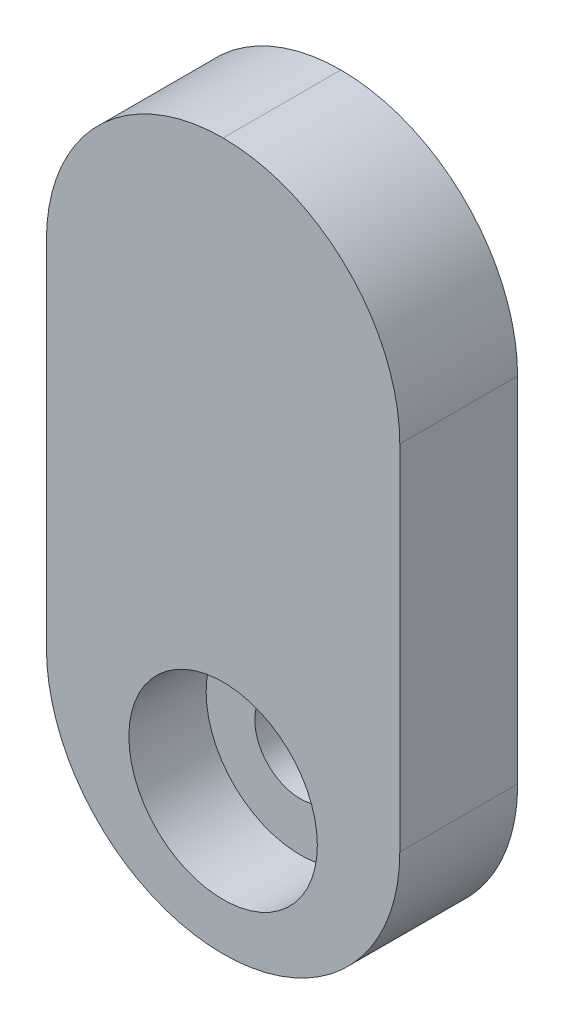
ISO-10303-21;
HEADER;
FILE_DESCRIPTION(('STEP AP214'),'2;1');
FILE_NAME('part.step','',(''),(''),'','','');
FILE_SCHEMA(('AUTOMOTIVE_DESIGN { 1 0 10303 214 1 1 1 1 }'));
ENDSEC;
DATA;
#1=APPLICATION_CONTEXT('core data for automotive mechanical design processes');
#2=APPLICATION_PROTOCOL_DEFINITION('international standard','automotive_design',2000,#1);
#3=PRODUCT_CONTEXT('',#1,'mechanical');
#4=PRODUCT('Part','Part','',(#3));
#5=PRODUCT_RELATED_PRODUCT_CATEGORY('part','',(#4));
#6=PRODUCT_DEFINITION_FORMATION('','',#4);
#7=PRODUCT_DEFINITION_CONTEXT('part definition',#1,'design');
#8=PRODUCT_DEFINITION('design','',#6,#7);
#9=PRODUCT_DEFINITION_SHAPE('','',#8);
#10=(LENGTH_UNIT() NAMED_UNIT(*) SI_UNIT(.MILLI.,.METRE.));
#11=(NAMED_UNIT(*) PLANE_ANGLE_UNIT() SI_UNIT($,.RADIAN.));
#12=(NAMED_UNIT(*) SI_UNIT($,.STERADIAN.) SOLID_ANGLE_UNIT());
#13=UNCERTAINTY_MEASURE_WITH_UNIT(LENGTH_MEASURE(1.E-05),#10,'distance_accuracy_value','');
#14=(GEOMETRIC_REPRESENTATION_CONTEXT(3) GLOBAL_UNCERTAINTY_ASSIGNED_CONTEXT((#13)) GLOBAL_UNIT_ASSIGNED_CONTEXT((#10,
#11,#12)) REPRESENTATION_CONTEXT('',''));
#15=CARTESIAN_POINT('',(0.,0.,0.));
#16=DIRECTION('',(0.,0.,1.));
#17=DIRECTION('',(1.,0.,0.));
#18=AXIS2_PLACEMENT_3D('',#15,#16,#17);
#19=CARTESIAN_POINT('',(9.52499999999999,38.1,6.35));
#20=DIRECTION('',(-1.,0.,0.));
#21=DIRECTION('',(0.,-1.,0.));
#22=AXIS2_PLACEMENT_3D('',#19,#20,#21);
#23=PLANE('',#22);
#24=DIRECTION('',(0.,1.,0.));
#25=VECTOR('',#24,1.);
#26=CARTESIAN_POINT('',(9.52499999999999,38.1,0.));
#27=LINE('',#26,#25);
#28=CARTESIAN_POINT('',(9.525,9.525,0.));
#29=VERTEX_POINT('',#28);
#30=CARTESIAN_POINT('',(9.525,28.575,0.));
#31=VERTEX_POINT('',#30);
#32=EDGE_CURVE('E97',#29,#31,#27,.T.);
#33=ORIENTED_EDGE('',*,*,#32,.T.);
#34=DIRECTION('',(0.,0.,-1.));
#35=VECTOR('',#34,1.);
#36=CARTESIAN_POINT('',(9.525,28.575,6.35));
#37=LINE('',#36,#35);
#38=CARTESIAN_POINT('',(9.525,28.575,6.35));
#39=VERTEX_POINT('',#38);
#40=EDGE_CURVE('E114',#31,#39,#37,.F.);
#41=ORIENTED_EDGE('',*,*,#40,.T.);
#42=DIRECTION('',(0.,1.,0.));
#43=VECTOR('',#42,1.);
#44=CARTESIAN_POINT('',(9.52499999999999,38.1,6.35));
#45=LINE('',#44,#43);
#46=CARTESIAN_POINT('',(9.525,9.525,6.35));
#47=VERTEX_POINT('',#46);
#48=EDGE_CURVE('E141',#47,#39,#45,.T.);
#49=ORIENTED_EDGE('',*,*,#48,.F.);
#50=DIRECTION('',(0.,0.,-1.));
#51=VECTOR('',#50,1.);
#52=CARTESIAN_POINT('',(9.525,9.525,6.35));
#53=LINE('',#52,#51);
#54=EDGE_CURVE('E112',#47,#29,#53,.T.);
#55=ORIENTED_EDGE('',*,*,#54,.T.);
#56=EDGE_LOOP('',(#33,#41,#49,#55));
#57=FACE_BOUND('',#56,.T.);
#58=ADVANCED_FACE('F37',(#57),#23,.F.);
#59=CARTESIAN_POINT('',(-9.52500000000001,38.1,6.35));
#60=DIRECTION('',(1.,0.,0.));
#61=DIRECTION('',(0.,1.,0.));
#62=AXIS2_PLACEMENT_3D('',#59,#60,#61);
#63=PLANE('',#62);
#64=DIRECTION('',(0.,-1.,0.));
#65=VECTOR('',#64,1.);
#66=CARTESIAN_POINT('',(-9.52500000000001,38.1,6.35));
#67=LINE('',#66,#65);
#68=CARTESIAN_POINT('',(-9.52500000000001,28.575,6.35));
#69=VERTEX_POINT('',#68);
#70=CARTESIAN_POINT('',(-9.525,9.525,6.35));
#71=VERTEX_POINT('',#70);
#72=EDGE_CURVE('E107',#69,#71,#67,.T.);
#73=ORIENTED_EDGE('',*,*,#72,.F.);
#74=DIRECTION('',(0.,0.,-1.));
#75=VECTOR('',#74,1.);
#76=CARTESIAN_POINT('',(-9.52500000000001,28.575,6.35));
#77=LINE('',#76,#75);
#78=CARTESIAN_POINT('',(-9.52500000000001,28.575,0.));
#79=VERTEX_POINT('',#78);
#80=EDGE_CURVE('E11',#69,#79,#77,.T.);
#81=ORIENTED_EDGE('',*,*,#80,.T.);
#82=DIRECTION('',(0.,-1.,0.));
#83=VECTOR('',#82,1.);
#84=CARTESIAN_POINT('',(-9.52500000000001,38.1,0.));
#85=LINE('',#84,#83);
#86=CARTESIAN_POINT('',(-9.525,9.525,0.));
#87=VERTEX_POINT('',#86);
#88=EDGE_CURVE('E137',#79,#87,#85,.T.);
#89=ORIENTED_EDGE('',*,*,#88,.T.);
#90=DIRECTION('',(0.,0.,-1.));
#91=VECTOR('',#90,1.);
#92=CARTESIAN_POINT('',(-9.525,9.525,6.35));
#93=LINE('',#92,#91);
#94=EDGE_CURVE('E46',#87,#71,#93,.F.);
#95=ORIENTED_EDGE('',*,*,#94,.T.);
#96=EDGE_LOOP('',(#73,#81,#89,#95));
#97=FACE_BOUND('',#96,.T.);
#98=ADVANCED_FACE('F139',(#97),#63,.F.);
#99=CARTESIAN_POINT('',(0.,0.,6.35));
#100=DIRECTION('',(0.,0.,1.));
#101=DIRECTION('',(1.,0.,0.));
#102=AXIS2_PLACEMENT_3D('',#99,#100,#101);
#103=PLANE('',#102);
#104=CARTESIAN_POINT('',(0.,7.62,6.35));
#105=DIRECTION('',(0.,0.,1.));
#106=DIRECTION('',(1.,0.,0.));
#107=AXIS2_PLACEMENT_3D('',#104,#105,#106);
#108=CIRCLE('',#107,5.08);
#109=CARTESIAN_POINT('',(5.08,7.62,6.35));
#110=VERTEX_POINT('',#109);
#111=EDGE_CURVE('E153',#110,#110,#108,.T.);
#112=ORIENTED_EDGE('',*,*,#111,.F.);
#113=EDGE_LOOP('',(#112));
#114=FACE_BOUND('',#113,.T.);
#115=ORIENTED_EDGE('',*,*,#48,.T.);
#116=CARTESIAN_POINT('',(0.,28.575,6.35));
#117=DIRECTION('',(0.,0.,1.));
#118=DIRECTION('',(1.,0.,0.));
#119=AXIS2_PLACEMENT_3D('',#116,#117,#118);
#120=CIRCLE('',#119,9.525);
#121=CARTESIAN_POINT('',(0.,38.1,6.35));
#122=VERTEX_POINT('',#121);
#123=EDGE_CURVE('E122',#39,#122,#120,.T.);
#124=ORIENTED_EDGE('',*,*,#123,.T.);
#125=CARTESIAN_POINT('',(0.,28.575,6.35));
#126=DIRECTION('',(0.,0.,1.));
#127=DIRECTION('',(1.,0.,0.));
#128=AXIS2_PLACEMENT_3D('',#125,#126,#127);
#129=CIRCLE('',#128,9.525);
#130=EDGE_CURVE('E120',#122,#69,#129,.T.);
#131=ORIENTED_EDGE('',*,*,#130,.T.);
#132=ORIENTED_EDGE('',*,*,#72,.T.);
#133=CARTESIAN_POINT('',(0.,9.525,6.35));
#134=DIRECTION('',(0.,0.,1.));
#135=DIRECTION('',(1.,0.,0.));
#136=AXIS2_PLACEMENT_3D('',#133,#134,#135);
#137=CIRCLE('',#136,9.525);
#138=CARTESIAN_POINT('',(0.,0.,6.35));
#139=VERTEX_POINT('',#138);
#140=EDGE_CURVE('E54',#71,#139,#137,.T.);
#141=ORIENTED_EDGE('',*,*,#140,.T.);
#142=CARTESIAN_POINT('',(0.,9.525,6.35));
#143=DIRECTION('',(0.,0.,1.));
#144=DIRECTION('',(1.,0.,0.));
#145=AXIS2_PLACEMENT_3D('',#142,#143,#144);
#146=CIRCLE('',#145,9.525);
#147=EDGE_CURVE('E118',#139,#47,#146,.T.);
#148=ORIENTED_EDGE('',*,*,#147,.T.);
#149=EDGE_LOOP('',(#115,#124,#131,#132,#141,#148));
#150=FACE_BOUND('',#149,.T.);
#151=ADVANCED_FACE('F185',(#114,#150),#103,.T.);
#152=CARTESIAN_POINT('',(0.,0.,0.));
#153=DIRECTION('',(0.,0.,1.));
#154=DIRECTION('',(1.,0.,0.));
#155=AXIS2_PLACEMENT_3D('',#152,#153,#154);
#156=PLANE('',#155);
#157=CARTESIAN_POINT('',(0.,28.575,0.));
#158=DIRECTION('',(0.,0.,1.));
#159=DIRECTION('',(1.,0.,0.));
#160=AXIS2_PLACEMENT_3D('',#157,#158,#159);
#161=CIRCLE('',#160,9.525);
#162=CARTESIAN_POINT('',(0.,38.1,0.));
#163=VERTEX_POINT('',#162);
#164=EDGE_CURVE('E102',#79,#163,#161,.F.);
#165=ORIENTED_EDGE('',*,*,#164,.T.);
#166=CARTESIAN_POINT('',(0.,28.575,0.));
#167=DIRECTION('',(0.,0.,1.));
#168=DIRECTION('',(1.,0.,0.));
#169=AXIS2_PLACEMENT_3D('',#166,#167,#168);
#170=CIRCLE('',#169,9.525);
#171=EDGE_CURVE('E105',#163,#31,#170,.F.);
#172=ORIENTED_EDGE('',*,*,#171,.T.);
#173=ORIENTED_EDGE('',*,*,#32,.F.);
#174=CARTESIAN_POINT('',(0.,9.525,0.));
#175=DIRECTION('',(0.,0.,1.));
#176=DIRECTION('',(1.,0.,0.));
#177=AXIS2_PLACEMENT_3D('',#174,#175,#176);
#178=CIRCLE('',#177,9.525);
#179=CARTESIAN_POINT('',(0.,0.,0.));
#180=VERTEX_POINT('',#179);
#181=EDGE_CURVE('E92',#29,#180,#178,.F.);
#182=ORIENTED_EDGE('',*,*,#181,.T.);
#183=CARTESIAN_POINT('',(0.,7.62,0.));
#184=DIRECTION('',(0.,0.,-1.));
#185=DIRECTION('',(-1.,0.,0.));
#186=AXIS2_PLACEMENT_3D('',#183,#184,#185);
#187=CIRCLE('',#186,7.62);
#188=EDGE_CURVE('E95',#180,#180,#187,.T.);
#189=ORIENTED_EDGE('',*,*,#188,.F.);
#190=CARTESIAN_POINT('',(0.,9.525,0.));
#191=DIRECTION('',(0.,0.,1.));
#192=DIRECTION('',(1.,0.,0.));
#193=AXIS2_PLACEMENT_3D('',#190,#191,#192);
#194=CIRCLE('',#193,9.525);
#195=EDGE_CURVE('E103',#180,#87,#194,.F.);
#196=ORIENTED_EDGE('',*,*,#195,.T.);
#197=ORIENTED_EDGE('',*,*,#88,.F.);
#198=EDGE_LOOP('',(#165,#172,#173,#182,#189,#196,#197));
#199=FACE_BOUND('',#198,.T.);
#200=ADVANCED_FACE('F93',(#199),#156,.F.);
#201=CARTESIAN_POINT('',(0.,7.62,6.35));
#202=DIRECTION('',(0.,0.,1.));
#203=DIRECTION('',(1.,0.,0.));
#204=AXIS2_PLACEMENT_3D('',#201,#202,#203);
#205=CYLINDRICAL_SURFACE('',#204,2.45745);
#206=CARTESIAN_POINT('',(0.,7.62,2.1844));
#207=DIRECTION('',(0.,0.,1.));
#208=DIRECTION('',(1.,0.,0.));
#209=AXIS2_PLACEMENT_3D('',#206,#207,#208);
#210=CIRCLE('',#209,2.45745);
#211=CARTESIAN_POINT('',(2.45745,7.62,2.1844));
#212=VERTEX_POINT('',#211);
#213=EDGE_CURVE('E144',#212,#212,#210,.T.);
#214=ORIENTED_EDGE('',*,*,#213,.T.);
#215=EDGE_LOOP('',(#214));
#216=FACE_BOUND('',#215,.T.);
#217=CARTESIAN_POINT('',(0.,7.62,-1.27));
#218=DIRECTION('',(0.,0.,-1.));
#219=DIRECTION('',(-1.,0.,0.));
#220=AXIS2_PLACEMENT_3D('',#217,#218,#219);
#221=CIRCLE('',#220,2.45745);
#222=CARTESIAN_POINT('',(-2.45745,7.62,-1.27));
#223=VERTEX_POINT('',#222);
#224=EDGE_CURVE('E126',#223,#223,#221,.T.);
#225=ORIENTED_EDGE('',*,*,#224,.T.);
#226=EDGE_LOOP('',(#225));
#227=FACE_BOUND('',#226,.T.);
#228=ADVANCED_FACE('F220',(#216,#227),#205,.F.);
#229=CARTESIAN_POINT('',(2.45745,7.62,2.1844));
#230=DIRECTION('',(0.,0.,-1.));
#231=DIRECTION('',(-1.,0.,0.));
#232=AXIS2_PLACEMENT_3D('',#229,#230,#231);
#233=PLANE('',#232);
#234=ORIENTED_EDGE('',*,*,#213,.F.);
#235=EDGE_LOOP('',(#234));
#236=FACE_BOUND('',#235,.T.);
#237=CARTESIAN_POINT('',(0.,7.62,2.1844));
#238=DIRECTION('',(0.,0.,1.));
#239=DIRECTION('',(1.,0.,0.));
#240=AXIS2_PLACEMENT_3D('',#237,#238,#239);
#241=CIRCLE('',#240,5.08);
#242=CARTESIAN_POINT('',(5.08,7.62,2.1844));
#243=VERTEX_POINT('',#242);
#244=EDGE_CURVE('E150',#243,#243,#241,.T.);
#245=ORIENTED_EDGE('',*,*,#244,.T.);
#246=EDGE_LOOP('',(#245));
#247=FACE_BOUND('',#246,.T.);
#248=ADVANCED_FACE('F259',(#236,#247),#233,.F.);
#249=CARTESIAN_POINT('',(0.,7.62,6.35));
#250=DIRECTION('',(0.,0.,1.));
#251=DIRECTION('',(1.,0.,0.));
#252=AXIS2_PLACEMENT_3D('',#249,#250,#251);
#253=CYLINDRICAL_SURFACE('',#252,5.08);
#254=ORIENTED_EDGE('',*,*,#244,.F.);
#255=EDGE_LOOP('',(#254));
#256=FACE_BOUND('',#255,.T.);
#257=ORIENTED_EDGE('',*,*,#111,.T.);
#258=EDGE_LOOP('',(#257));
#259=FACE_BOUND('',#258,.T.);
#260=ADVANCED_FACE('F176',(#256,#259),#253,.F.);
#261=CARTESIAN_POINT('',(0.,7.62,-1.27));
#262=DIRECTION('',(0.,0.,-1.));
#263=DIRECTION('',(-1.,0.,0.));
#264=AXIS2_PLACEMENT_3D('',#261,#262,#263);
#265=PLANE('',#264);
#266=CARTESIAN_POINT('',(0.,7.62,-1.27));
#267=DIRECTION('',(0.,0.,-1.));
#268=DIRECTION('',(-1.,0.,0.));
#269=AXIS2_PLACEMENT_3D('',#266,#267,#268);
#270=CIRCLE('',#269,7.62);
#271=CARTESIAN_POINT('',(-7.62,7.62,-1.27));
#272=VERTEX_POINT('',#271);
#273=EDGE_CURVE('E156',#272,#272,#270,.T.);
#274=ORIENTED_EDGE('',*,*,#273,.T.);
#275=EDGE_LOOP('',(#274));
#276=FACE_BOUND('',#275,.T.);
#277=ORIENTED_EDGE('',*,*,#224,.F.);
#278=EDGE_LOOP('',(#277));
#279=FACE_BOUND('',#278,.T.);
#280=ADVANCED_FACE('F161',(#276,#279),#265,.T.);
#281=CARTESIAN_POINT('',(0.,7.62,-1.27));
#282=DIRECTION('',(0.,0.,1.));
#283=DIRECTION('',(1.,0.,0.));
#284=AXIS2_PLACEMENT_3D('',#281,#282,#283);
#285=CYLINDRICAL_SURFACE('',#284,7.62);
#286=ORIENTED_EDGE('',*,*,#273,.F.);
#287=EDGE_LOOP('',(#286));
#288=FACE_BOUND('',#287,.T.);
#289=ORIENTED_EDGE('',*,*,#188,.T.);
#290=EDGE_LOOP('',(#289));
#291=FACE_BOUND('',#290,.T.);
#292=ADVANCED_FACE('F164',(#288,#291),#285,.T.);
#293=CARTESIAN_POINT('',(0.,28.575,6.35));
#294=DIRECTION('',(0.,0.,-1.));
#295=DIRECTION('',(-1.,0.,0.));
#296=AXIS2_PLACEMENT_3D('',#293,#294,#295);
#297=CYLINDRICAL_SURFACE('',#296,9.525);
#298=ORIENTED_EDGE('',*,*,#80,.F.);
#299=ORIENTED_EDGE('',*,*,#130,.F.);
#300=DIRECTION('',(0.,0.,-1.));
#301=VECTOR('',#300,1.);
#302=CARTESIAN_POINT('',(0.,38.1,6.35));
#303=LINE('',#302,#301);
#304=EDGE_CURVE('E124',#163,#122,#303,.F.);
#305=ORIENTED_EDGE('',*,*,#304,.F.);
#306=ORIENTED_EDGE('',*,*,#164,.F.);
#307=EDGE_LOOP('',(#298,#299,#305,#306));
#308=FACE_BOUND('',#307,.T.);
#309=ADVANCED_FACE('F167',(#308),#297,.T.);
#310=CARTESIAN_POINT('',(0.,28.575,6.35));
#311=DIRECTION('',(0.,0.,-1.));
#312=DIRECTION('',(-1.,0.,0.));
#313=AXIS2_PLACEMENT_3D('',#310,#311,#312);
#314=CYLINDRICAL_SURFACE('',#313,9.525);
#315=ORIENTED_EDGE('',*,*,#123,.F.);
#316=ORIENTED_EDGE('',*,*,#40,.F.);
#317=ORIENTED_EDGE('',*,*,#171,.F.);
#318=ORIENTED_EDGE('',*,*,#304,.T.);
#319=EDGE_LOOP('',(#315,#316,#317,#318));
#320=FACE_BOUND('',#319,.T.);
#321=ADVANCED_FACE('F173',(#320),#314,.T.);
#322=CARTESIAN_POINT('',(0.,9.525,6.35));
#323=DIRECTION('',(0.,0.,-1.));
#324=DIRECTION('',(-1.,0.,0.));
#325=AXIS2_PLACEMENT_3D('',#322,#323,#324);
#326=CYLINDRICAL_SURFACE('',#325,9.525);
#327=DIRECTION('',(0.,0.,-1.));
#328=VECTOR('',#327,1.);
#329=CARTESIAN_POINT('',(0.,0.,6.35));
#330=LINE('',#329,#328);
#331=EDGE_CURVE('E41',#139,#180,#330,.T.);
#332=ORIENTED_EDGE('',*,*,#331,.F.);
#333=ORIENTED_EDGE('',*,*,#140,.F.);
#334=ORIENTED_EDGE('',*,*,#94,.F.);
#335=ORIENTED_EDGE('',*,*,#195,.F.);
#336=EDGE_LOOP('',(#332,#333,#334,#335));
#337=FACE_BOUND('',#336,.T.);
#338=ADVANCED_FACE('F39',(#337),#326,.T.);
#339=CARTESIAN_POINT('',(0.,9.525,6.35));
#340=DIRECTION('',(0.,0.,-1.));
#341=DIRECTION('',(-1.,0.,0.));
#342=AXIS2_PLACEMENT_3D('',#339,#340,#341);
#343=CYLINDRICAL_SURFACE('',#342,9.525);
#344=ORIENTED_EDGE('',*,*,#147,.F.);
#345=ORIENTED_EDGE('',*,*,#331,.T.);
#346=ORIENTED_EDGE('',*,*,#181,.F.);
#347=ORIENTED_EDGE('',*,*,#54,.F.);
#348=EDGE_LOOP('',(#344,#345,#346,#347));
#349=FACE_BOUND('',#348,.T.);
#350=ADVANCED_FACE('F133',(#349),#343,.T.);
#351=CLOSED_SHELL('',(#58,#98,#151,#200,#228,#248,#260,#280,#292,#309,#321,#338,#350));
#352=MANIFOLD_SOLID_BREP('B2',#351);
#353=ADVANCED_BREP_SHAPE_REPRESENTATION('',(#18,#352),#14);
#354=SHAPE_DEFINITION_REPRESENTATION(#9,#353);
ENDSEC;
END-ISO-10303-21;
